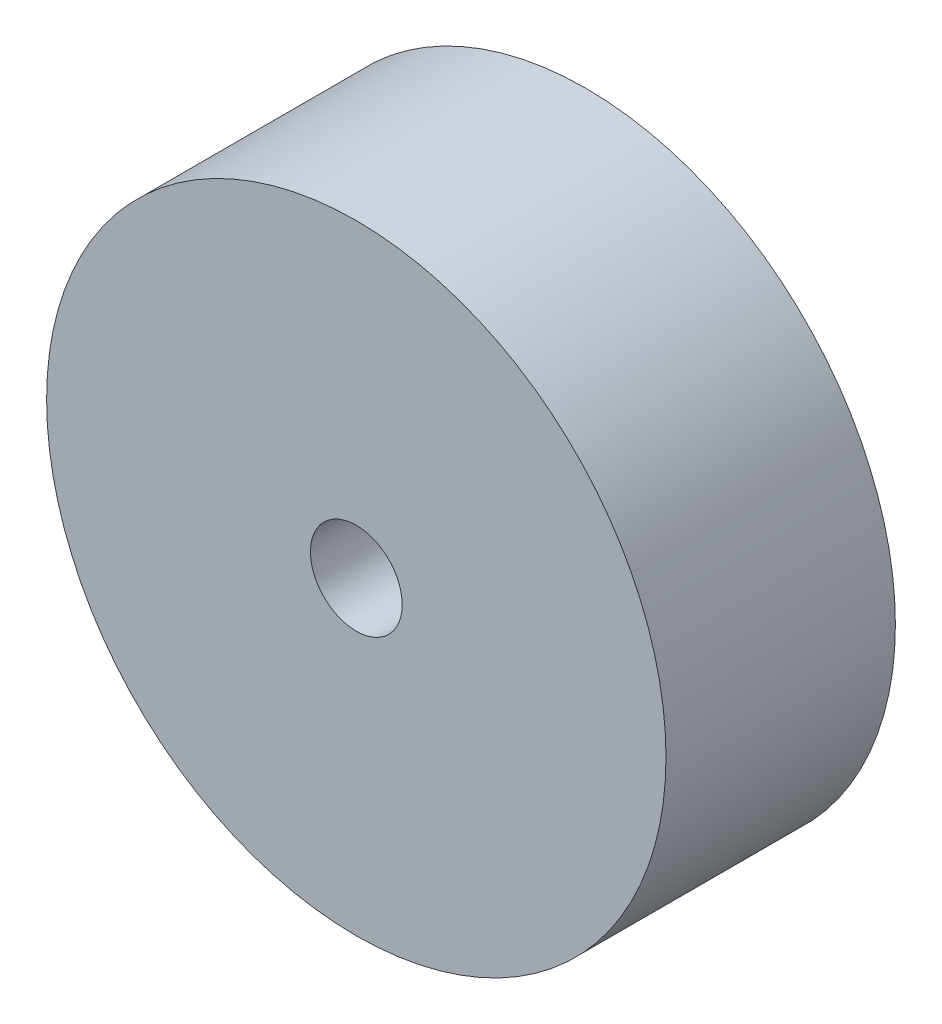
ISO-10303-21;
HEADER;
FILE_DESCRIPTION(('STEP AP214'),'2;1');
FILE_NAME('part.step','',(''),(''),'','','');
FILE_SCHEMA(('AUTOMOTIVE_DESIGN { 1 0 10303 214 1 1 1 1 }'));
ENDSEC;
DATA;
#1=APPLICATION_CONTEXT('core data for automotive mechanical design processes');
#2=APPLICATION_PROTOCOL_DEFINITION('international standard','automotive_design',2000,#1);
#3=PRODUCT_CONTEXT('',#1,'mechanical');
#4=PRODUCT('Part','Part','',(#3));
#5=PRODUCT_RELATED_PRODUCT_CATEGORY('part','',(#4));
#6=PRODUCT_DEFINITION_FORMATION('','',#4);
#7=PRODUCT_DEFINITION_CONTEXT('part definition',#1,'design');
#8=PRODUCT_DEFINITION('design','',#6,#7);
#9=PRODUCT_DEFINITION_SHAPE('','',#8);
#10=(LENGTH_UNIT() NAMED_UNIT(*) SI_UNIT(.MILLI.,.METRE.));
#11=(NAMED_UNIT(*) PLANE_ANGLE_UNIT() SI_UNIT($,.RADIAN.));
#12=(NAMED_UNIT(*) SI_UNIT($,.STERADIAN.) SOLID_ANGLE_UNIT());
#13=UNCERTAINTY_MEASURE_WITH_UNIT(LENGTH_MEASURE(1.E-05),#10,'distance_accuracy_value','');
#14=(GEOMETRIC_REPRESENTATION_CONTEXT(3) GLOBAL_UNCERTAINTY_ASSIGNED_CONTEXT((#13)) GLOBAL_UNIT_ASSIGNED_CONTEXT((#10,
#11,#12)) REPRESENTATION_CONTEXT('',''));
#15=CARTESIAN_POINT('',(0.,0.,0.));
#16=DIRECTION('',(0.,0.,1.));
#17=DIRECTION('',(1.,0.,0.));
#18=AXIS2_PLACEMENT_3D('',#15,#16,#17);
#19=CARTESIAN_POINT('',(0.,0.,5.));
#20=DIRECTION('',(0.,0.,1.));
#21=DIRECTION('',(1.,0.,0.));
#22=AXIS2_PLACEMENT_3D('',#19,#20,#21);
#23=PLANE('',#22);
#24=CARTESIAN_POINT('',(0.,0.,5.));
#25=DIRECTION('',(0.,0.,1.));
#26=DIRECTION('',(1.,0.,0.));
#27=AXIS2_PLACEMENT_3D('',#24,#25,#26);
#28=CIRCLE('',#27,6.75);
#29=CARTESIAN_POINT('',(6.75,0.,5.));
#30=VERTEX_POINT('',#29);
#31=EDGE_CURVE('E10',#30,#30,#28,.T.);
#32=ORIENTED_EDGE('',*,*,#31,.T.);
#33=EDGE_LOOP('',(#32));
#34=FACE_BOUND('',#33,.T.);
#35=CARTESIAN_POINT('',(0.,0.,5.));
#36=DIRECTION('',(0.,0.,1.));
#37=DIRECTION('',(1.,0.,0.));
#38=AXIS2_PLACEMENT_3D('',#35,#36,#37);
#39=CIRCLE('',#38,1.);
#40=CARTESIAN_POINT('',(1.,0.,5.));
#41=VERTEX_POINT('',#40);
#42=EDGE_CURVE('E41',#41,#41,#39,.T.);
#43=ORIENTED_EDGE('',*,*,#42,.F.);
#44=EDGE_LOOP('',(#43));
#45=FACE_BOUND('',#44,.T.);
#46=ADVANCED_FACE('F30',(#34,#45),#23,.T.);
#47=CARTESIAN_POINT('',(0.,0.,0.));
#48=DIRECTION('',(0.,0.,1.));
#49=DIRECTION('',(1.,0.,0.));
#50=AXIS2_PLACEMENT_3D('',#47,#48,#49);
#51=PLANE('',#50);
#52=CARTESIAN_POINT('',(0.,0.,0.));
#53=DIRECTION('',(0.,0.,1.));
#54=DIRECTION('',(1.,0.,0.));
#55=AXIS2_PLACEMENT_3D('',#52,#53,#54);
#56=CIRCLE('',#55,6.75);
#57=CARTESIAN_POINT('',(6.75,0.,0.));
#58=VERTEX_POINT('',#57);
#59=EDGE_CURVE('E34',#58,#58,#56,.T.);
#60=ORIENTED_EDGE('',*,*,#59,.F.);
#61=EDGE_LOOP('',(#60));
#62=FACE_BOUND('',#61,.T.);
#63=CARTESIAN_POINT('',(0.,0.,0.));
#64=DIRECTION('',(0.,0.,1.));
#65=DIRECTION('',(1.,0.,0.));
#66=AXIS2_PLACEMENT_3D('',#63,#64,#65);
#67=CIRCLE('',#66,1.);
#68=CARTESIAN_POINT('',(1.,0.,0.));
#69=VERTEX_POINT('',#68);
#70=EDGE_CURVE('E43',#69,#69,#67,.T.);
#71=ORIENTED_EDGE('',*,*,#70,.T.);
#72=EDGE_LOOP('',(#71));
#73=FACE_BOUND('',#72,.T.);
#74=ADVANCED_FACE('F53',(#62,#73),#51,.F.);
#75=CARTESIAN_POINT('',(0.,0.,5.));
#76=DIRECTION('',(0.,0.,-1.));
#77=DIRECTION('',(-1.,0.,0.));
#78=AXIS2_PLACEMENT_3D('',#75,#76,#77);
#79=CYLINDRICAL_SURFACE('',#78,6.75);
#80=ORIENTED_EDGE('',*,*,#31,.F.);
#81=EDGE_LOOP('',(#80));
#82=FACE_BOUND('',#81,.T.);
#83=ORIENTED_EDGE('',*,*,#59,.T.);
#84=EDGE_LOOP('',(#83));
#85=FACE_BOUND('',#84,.T.);
#86=ADVANCED_FACE('F32',(#82,#85),#79,.T.);
#87=CARTESIAN_POINT('',(0.,0.,5.));
#88=DIRECTION('',(0.,0.,-1.));
#89=DIRECTION('',(-1.,0.,0.));
#90=AXIS2_PLACEMENT_3D('',#87,#88,#89);
#91=CYLINDRICAL_SURFACE('',#90,1.);
#92=ORIENTED_EDGE('',*,*,#42,.T.);
#93=EDGE_LOOP('',(#92));
#94=FACE_BOUND('',#93,.T.);
#95=ORIENTED_EDGE('',*,*,#70,.F.);
#96=EDGE_LOOP('',(#95));
#97=FACE_BOUND('',#96,.T.);
#98=ADVANCED_FACE('F49',(#94,#97),#91,.F.);
#99=CLOSED_SHELL('',(#46,#74,#86,#98));
#100=MANIFOLD_SOLID_BREP('B2',#99);
#101=ADVANCED_BREP_SHAPE_REPRESENTATION('',(#18,#100),#14);
#102=SHAPE_DEFINITION_REPRESENTATION(#9,#101);
ENDSEC;
END-ISO-10303-21;
